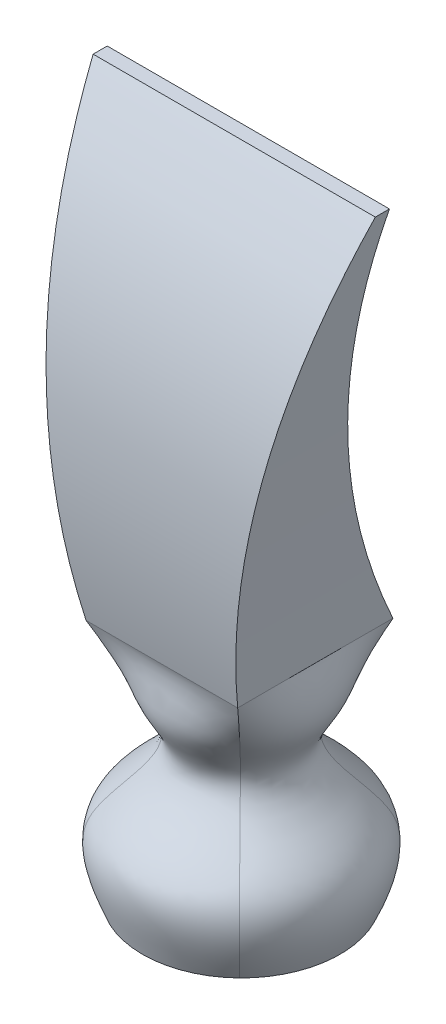
ISO-10303-21;
HEADER;
FILE_DESCRIPTION(('STEP AP214'),'2;1');
FILE_NAME('part.step','',(''),(''),'','','');
FILE_SCHEMA(('AUTOMOTIVE_DESIGN { 1 0 10303 214 1 1 1 1 }'));
ENDSEC;
DATA;
#1=APPLICATION_CONTEXT('core data for automotive mechanical design processes');
#2=APPLICATION_PROTOCOL_DEFINITION('international standard','automotive_design',2000,#1);
#3=PRODUCT_CONTEXT('',#1,'mechanical');
#4=PRODUCT('Part','Part','',(#3));
#5=PRODUCT_RELATED_PRODUCT_CATEGORY('part','',(#4));
#6=PRODUCT_DEFINITION_FORMATION('','',#4);
#7=PRODUCT_DEFINITION_CONTEXT('part definition',#1,'design');
#8=PRODUCT_DEFINITION('design','',#6,#7);
#9=PRODUCT_DEFINITION_SHAPE('','',#8);
#10=(LENGTH_UNIT() NAMED_UNIT(*) SI_UNIT(.MILLI.,.METRE.));
#11=(NAMED_UNIT(*) PLANE_ANGLE_UNIT() SI_UNIT($,.RADIAN.));
#12=(NAMED_UNIT(*) SI_UNIT($,.STERADIAN.) SOLID_ANGLE_UNIT());
#13=UNCERTAINTY_MEASURE_WITH_UNIT(LENGTH_MEASURE(1.E-05),#10,'distance_accuracy_value','');
#14=(GEOMETRIC_REPRESENTATION_CONTEXT(3) GLOBAL_UNCERTAINTY_ASSIGNED_CONTEXT((#13)) GLOBAL_UNIT_ASSIGNED_CONTEXT((#10,
#11,#12)) REPRESENTATION_CONTEXT('',''));
#15=CARTESIAN_POINT('',(0.,0.,0.));
#16=DIRECTION('',(0.,0.,1.));
#17=DIRECTION('',(1.,0.,0.));
#18=AXIS2_PLACEMENT_3D('',#15,#16,#17);
#19=CARTESIAN_POINT('',(0.,0.,0.));
#20=DIRECTION('',(0.,1.,0.));
#21=DIRECTION('',(0.,0.,1.));
#22=AXIS2_PLACEMENT_3D('',#19,#20,#21);
#23=PLANE('',#22);
#24=CARTESIAN_POINT('',(0.,0.,0.));
#25=DIRECTION('',(0.,1.,0.));
#26=DIRECTION('',(0.,0.,1.));
#27=AXIS2_PLACEMENT_3D('',#24,#25,#26);
#28=CIRCLE('',#27,35.);
#29=CARTESIAN_POINT('',(24.4568286600707,0.,25.037242897171));
#30=VERTEX_POINT('',#29);
#31=CARTESIAN_POINT('',(24.4568286600707,0.,-25.0372428971711));
#32=VERTEX_POINT('',#31);
#33=EDGE_CURVE('E444',#30,#32,#28,.T.);
#34=ORIENTED_EDGE('',*,*,#33,.F.);
#35=CARTESIAN_POINT('',(-24.4568286600708,0.,25.037242897171));
#36=VERTEX_POINT('',#35);
#37=EDGE_CURVE('E287',#36,#30,#28,.T.);
#38=ORIENTED_EDGE('',*,*,#37,.F.);
#39=CARTESIAN_POINT('',(-24.4568286600707,0.,-25.037242897171));
#40=VERTEX_POINT('',#39);
#41=EDGE_CURVE('E455',#40,#36,#28,.T.);
#42=ORIENTED_EDGE('',*,*,#41,.F.);
#43=EDGE_CURVE('E451',#32,#40,#28,.T.);
#44=ORIENTED_EDGE('',*,*,#43,.F.);
#45=EDGE_LOOP('',(#34,#38,#42,#44));
#46=FACE_BOUND('',#45,.T.);
#47=ADVANCED_FACE('F189',(#46),#23,.F.);
#48=CARTESIAN_POINT('',(-24.4568286600707,0.,-25.037242897171));
#49=CARTESIAN_POINT('',(-27.399340941846,9.29663608562691,-28.0495874554414));
#50=CARTESIAN_POINT('',(-31.13445017752,27.9698970219637,-31.8897370915867));
#51=CARTESIAN_POINT('',(-9.03288607464205,45.1614896950675,-9.19041981699762));
#52=CARTESIAN_POINT('',(-19.9641415545963,66.5098480963599,-20.5564148321014));
#53=CARTESIAN_POINT('',(-24.3797828143427,78.4865117207972,-24.613655684619));
#54=CARTESIAN_POINT('',(-27.5,85.,-27.5));
#55=CARTESIAN_POINT('',(-26.1422855158477,0.,-23.3908583609433));
#56=CARTESIAN_POINT('',(-29.274811107581,9.29666061844231,-26.1946591791497));
#57=CARTESIAN_POINT('',(-33.3386493278666,27.9742060717197,-29.8139769824717));
#58=CARTESIAN_POINT('',(-9.47722497475231,45.1465067376922,-8.53279418407706));
#59=CARTESIAN_POINT('',(-21.7094282775271,66.5410850836467,-19.3141550163875));
#60=CARTESIAN_POINT('',(-24.9859238604661,78.3956275287834,-22.6773271838854));
#61=CARTESIAN_POINT('',(-27.5,85.,-25.2083333333333));
#62=CARTESIAN_POINT('',(-29.1456387891159,0.,-19.796098818231));
#63=CARTESIAN_POINT('',(-32.6581910007652,9.29670968407309,-22.1828121563094));
#64=CARTESIAN_POINT('',(-37.2358710883294,27.9828241712317,-25.24280284972));
#65=CARTESIAN_POINT('',(-10.294317579995,45.1165408229417,-7.15867958893231));
#66=CARTESIAN_POINT('',(-24.7729799374522,66.6035590582203,-16.4788044935238));
#67=CARTESIAN_POINT('',(-26.1982059527127,78.2138591447559,-18.804670182418));
#68=CARTESIAN_POINT('',(-27.5,85.,-20.625));
#69=CARTESIAN_POINT('',(-32.4672817206729,0.,-13.6661162175791));
#70=CARTESIAN_POINT('',(-36.3719989349256,9.29653958164828,-15.3088633728345));
#71=CARTESIAN_POINT('',(-41.5640845382798,27.9877406329618,-17.4416287093693));
#72=CARTESIAN_POINT('',(-11.1902813508322,45.0998300238232,-4.89533090328975));
#73=CARTESIAN_POINT('',(-28.1729827413746,66.6383680125747,-11.4726871464239));
#74=CARTESIAN_POINT('',(-27.5066219871479,78.1125958875504,-12.7007475080827));
#75=CARTESIAN_POINT('',(-27.5,85.0000000000001,-13.75));
#76=CARTESIAN_POINT('',(-34.5248320103974,0.,-7.02994300799264));
#77=CARTESIAN_POINT('',(-38.6791031346036,9.29672060989547,-7.87636956410796));
#78=CARTESIAN_POINT('',(-44.2398553148131,27.9893395313958,-8.97733972203747));
#79=CARTESIAN_POINT('',(-11.7507376209475,45.0939370748818,-2.50124207543735));
#80=CARTESIAN_POINT('',(-30.2687022347564,66.6506801310087,-5.93686263514309));
#81=CARTESIAN_POINT('',(-28.3468179264592,78.0767619113947,-6.43088185432212));
#82=CARTESIAN_POINT('',(-27.5,85.,-6.875));
#83=CARTESIAN_POINT('',(-35.2375839948012,0.,0.));
#84=CARTESIAN_POINT('',(-39.476962194166,9.29659382349259,0.));
#85=CARTESIAN_POINT('',(-45.1676191008502,27.9895538065451,0.));
#86=CARTESIAN_POINT('',(-11.9445194572559,45.093440277809,0.));
#87=CARTESIAN_POINT('',(-30.9952309837039,66.6516962929739,0.));
#88=CARTESIAN_POINT('',(-28.6363471343313,78.0738141662538,0.));
#89=CARTESIAN_POINT('',(-27.5,85.,0.));
#90=CARTESIAN_POINT('',(-34.5248320103974,0.,7.02994300799262));
#91=CARTESIAN_POINT('',(-38.6791031346037,9.29672060989549,7.87636956410796));
#92=CARTESIAN_POINT('',(-44.2398553148133,27.9893395313958,8.97733972203748));
#93=CARTESIAN_POINT('',(-11.7507376209475,45.0939370748819,2.50124207543732));
#94=CARTESIAN_POINT('',(-30.2687022347564,66.6506801310086,5.93686263514309));
#95=CARTESIAN_POINT('',(-28.3468179264593,78.0767619113946,6.43088185432212));
#96=CARTESIAN_POINT('',(-27.5,85.,6.875));
#97=CARTESIAN_POINT('',(-32.4672817206729,0.,13.6661162175791));
#98=CARTESIAN_POINT('',(-36.3719989349255,9.29653958164824,15.3088633728344));
#99=CARTESIAN_POINT('',(-41.5640845382795,27.9877406329618,17.4416287093693));
#100=CARTESIAN_POINT('',(-11.1902813508323,45.0998300238231,4.89533090328977));
#101=CARTESIAN_POINT('',(-28.1729827413746,66.6383680125748,11.4726871464239));
#102=CARTESIAN_POINT('',(-27.5066219871479,78.1125958875505,12.7007475080827));
#103=CARTESIAN_POINT('',(-27.5,85.,13.75));
#104=CARTESIAN_POINT('',(-29.1456387891159,0.,19.796098818231));
#105=CARTESIAN_POINT('',(-32.6581910007653,9.29670968407311,22.1828121563094));
#106=CARTESIAN_POINT('',(-37.2358710883296,27.9828241712318,25.24280284972));
#107=CARTESIAN_POINT('',(-10.294317579995,45.1165408229417,7.15867958893229));
#108=CARTESIAN_POINT('',(-24.7729799374522,66.6035590582203,16.4788044935238));
#109=CARTESIAN_POINT('',(-26.1982059527127,78.2138591447558,18.804670182418));
#110=CARTESIAN_POINT('',(-27.5,85.,20.625));
#111=CARTESIAN_POINT('',(-26.1422855158477,0.,23.3908583609433));
#112=CARTESIAN_POINT('',(-29.274811107581,9.29666061844231,26.1946591791497));
#113=CARTESIAN_POINT('',(-33.3386493278666,27.9742060717197,29.8139769824717));
#114=CARTESIAN_POINT('',(-9.47722497475231,45.1465067376922,8.53279418407707));
#115=CARTESIAN_POINT('',(-21.7094282775271,66.5410850836467,19.3141550163875));
#116=CARTESIAN_POINT('',(-24.9859238604661,78.3956275287834,22.6773271838854));
#117=CARTESIAN_POINT('',(-27.5,85.,25.2083333333333));
#118=CARTESIAN_POINT('',(-24.4568286600708,0.,25.037242897171));
#119=CARTESIAN_POINT('',(-27.399340941846,9.29663608562691,28.0495874554414));
#120=CARTESIAN_POINT('',(-31.13445017752,27.9698970219637,31.8897370915867));
#121=CARTESIAN_POINT('',(-9.03288607464205,45.1614896950675,9.19041981699762));
#122=CARTESIAN_POINT('',(-19.9641415545964,66.5098480963599,20.5564148321014));
#123=CARTESIAN_POINT('',(-24.3797828143427,78.4865117207972,24.613655684619));
#124=CARTESIAN_POINT('',(-27.5,85.,27.5));
#125=B_SPLINE_SURFACE_WITH_KNOTS('',3,3,((#48,#49,#50,#51,#52,#53,#54),(#55,#56,#57,#58,#59,#60,
#61),(#62,#63,#64,#65,#66,#67,#68),(#69,#70,#71,#72,#73,#74,#75),(#76,#77,#78,#79,#80,#81,#82),
(#83,#84,#85,#86,#87,#88,#89),(#90,#91,#92,#93,#94,#95,#96),(#97,#98,#99,#100,#101,#102,#103),
(#104,#105,#106,#107,#108,#109,#110),(#111,#112,#113,#114,#115,#116,#117),(#118,#119,#120,#121,
#122,#123,#124)),.UNSPECIFIED.,.F.,.F.,.F.,(4,1,1,1,1,1,1,1,4),(4,1,1,1,4),(0.,0.125,0.25,0.375,
0.5,0.625,0.75,0.875,1.),(0.,0.267666717961373,0.595145262150059,0.771109748555565,1.),.UNSPECIFIED.);
#126=CARTESIAN_POINT('',(-24.4568286600708,0.,25.037242897171));
#127=CARTESIAN_POINT('',(-27.399340941846,9.29663608562691,28.0495874554414));
#128=CARTESIAN_POINT('',(-31.13445017752,27.9698970219637,31.8897370915867));
#129=CARTESIAN_POINT('',(-9.03288607464205,45.1614896950675,9.19041981699762));
#130=CARTESIAN_POINT('',(-19.9641415545964,66.5098480963599,20.5564148321014));
#131=CARTESIAN_POINT('',(-24.3797828143427,78.4865117207972,24.613655684619));
#132=CARTESIAN_POINT('',(-27.5,85.,27.5));
#133=B_SPLINE_CURVE_WITH_KNOTS('',3,(#126,#127,#128,#129,#130,#131,#132),.UNSPECIFIED.,.F.,.F.,
(4,1,1,1,4),(0.,0.267666717961373,0.595145262150059,0.771109748555565,1.),.UNSPECIFIED.);
#134=CARTESIAN_POINT('',(-27.5,85.,27.5));
#135=VERTEX_POINT('',#134);
#136=EDGE_CURVE('E501',#36,#135,#133,.T.);
#137=DIRECTION('',(0.,0.,1.));
#138=VECTOR('',#137,1.);
#139=CARTESIAN_POINT('',(-27.5,85.,-27.5));
#140=LINE('',#139,#138);
#141=CARTESIAN_POINT('',(-27.5,85.,-27.5));
#142=VERTEX_POINT('',#141);
#143=EDGE_CURVE('E202',#142,#135,#140,.T.);
#144=CARTESIAN_POINT('',(-24.4568286600707,0.,-25.037242897171));
#145=CARTESIAN_POINT('',(-27.399340941846,9.29663608562691,-28.0495874554414));
#146=CARTESIAN_POINT('',(-31.13445017752,27.9698970219637,-31.8897370915867));
#147=CARTESIAN_POINT('',(-9.03288607464205,45.1614896950675,-9.19041981699762));
#148=CARTESIAN_POINT('',(-19.9641415545963,66.5098480963599,-20.5564148321014));
#149=CARTESIAN_POINT('',(-24.3797828143427,78.4865117207972,-24.613655684619));
#150=CARTESIAN_POINT('',(-27.5,85.,-27.5));
#151=B_SPLINE_CURVE_WITH_KNOTS('',3,(#144,#145,#146,#147,#148,#149,#150),.UNSPECIFIED.,.F.,.F.,
(4,1,1,1,4),(0.,0.267666717961373,0.595145262150059,0.771109748555565,1.),.UNSPECIFIED.);
#152=EDGE_CURVE('E504',#142,#40,#151,.F.);
#153=ORIENTED_EDGE('',*,*,#41,.T.);
#154=ORIENTED_EDGE('',*,*,#136,.T.);
#155=ORIENTED_EDGE('',*,*,#143,.F.);
#156=ORIENTED_EDGE('',*,*,#152,.T.);
#157=EDGE_LOOP('',(#153,#154,#155,#156));
#158=FACE_BOUND('',#157,.T.);
#159=ADVANCED_FACE('F520',(#158),#125,.T.);
#160=CARTESIAN_POINT('',(-24.4568286600708,0.,25.037242897171));
#161=CARTESIAN_POINT('',(-27.399340941846,9.29663608562691,28.0495874554414));
#162=CARTESIAN_POINT('',(-31.13445017752,27.9698970219637,31.8897370915867));
#163=CARTESIAN_POINT('',(-9.03288607464205,45.1614896950675,9.19041981699761));
#164=CARTESIAN_POINT('',(-19.9641415545964,66.5098480963599,20.5564148321014));
#165=CARTESIAN_POINT('',(-24.3797828143427,78.4865117207972,24.613655684619));
#166=CARTESIAN_POINT('',(-27.5,85.,27.5));
#167=CARTESIAN_POINT('',(-10.8664064473902,0.,38.3126114686484));
#168=CARTESIAN_POINT('',(-11.8472438746486,9.29663608562691,41.3249560269188));
#169=CARTESIAN_POINT('',(-14.1417780026572,27.9707826359351,50.352495786497));
#170=CARTESIAN_POINT('',(-3.57764647639151,45.1584201135384,11.7747419044727));
#171=CARTESIAN_POINT('',(-9.728521663523,66.5162468948495,35.9817913280261));
#172=CARTESIAN_POINT('',(-8.35759120619668,78.4678947262217,24.6066381393334));
#173=CARTESIAN_POINT('',(-9.59167063870443,85.,27.5));
#174=CARTESIAN_POINT('',(10.8664064473901,0.,38.3126114686484));
#175=CARTESIAN_POINT('',(11.8472438746486,9.29663608562691,41.3249560269188));
#176=CARTESIAN_POINT('',(14.1747437069648,27.9716682499065,50.3528296124604));
#177=CARTESIAN_POINT('',(3.46338572587735,45.1553505320094,11.773584847285));
#178=CARTESIAN_POINT('',(9.96670771947166,66.5226456933391,35.9842033101531));
#179=CARTESIAN_POINT('',(7.66460040194936,78.4492777316463,24.5996205940479));
#180=CARTESIAN_POINT('',(8.31665872259113,85.,27.5));
#181=CARTESIAN_POINT('',(24.4568286600707,0.,25.037242897171));
#182=CARTESIAN_POINT('',(27.399340941846,9.29663608562691,28.0495874554414));
#183=CARTESIAN_POINT('',(31.1674158818276,27.9725538638778,31.8907385694769));
#184=CARTESIAN_POINT('',(8.91862532412789,45.1522809504804,9.18694864543438));
#185=CARTESIAN_POINT('',(20.202327610545,66.5290444918287,20.5636507784824));
#186=CARTESIAN_POINT('',(23.6867920100954,78.430660737071,24.5926030487623));
#187=CARTESIAN_POINT('',(26.2249880838867,85.,27.5));
#188=B_SPLINE_SURFACE_WITH_KNOTS('',3,3,((#160,#161,#162,#163,#164,#165,#166),(#167,#168,#169,
#170,#171,#172,#173),(#174,#175,#176,#177,#178,#179,#180),(#181,#182,#183,#184,#185,#186,#187)),
.UNSPECIFIED.,.F.,.F.,.F.,(4,4),(4,1,1,1,4),(0.,1.),(0.,0.267666717961373,0.595145262150059,
0.771109748555565,1.),.UNSPECIFIED.);
#189=CARTESIAN_POINT('',(24.4568286600707,0.,25.037242897171));
#190=CARTESIAN_POINT('',(27.399340941846,9.29663608562691,28.0495874554414));
#191=CARTESIAN_POINT('',(31.1674158818276,27.9725538638778,31.8907385694769));
#192=CARTESIAN_POINT('',(8.91862532412789,45.1522809504804,9.18694864543438));
#193=CARTESIAN_POINT('',(20.202327610545,66.5290444918287,20.5636507784824));
#194=CARTESIAN_POINT('',(23.6867920100954,78.430660737071,24.5926030487623));
#195=CARTESIAN_POINT('',(26.2249880838867,85.,27.5));
#196=B_SPLINE_CURVE_WITH_KNOTS('',3,(#189,#190,#191,#192,#193,#194,#195),.UNSPECIFIED.,.F.,.F.,
(4,1,1,1,4),(0.,0.267666717961373,0.595145262150059,0.771109748555565,1.),.UNSPECIFIED.);
#197=CARTESIAN_POINT('',(26.2249880838867,85.,27.5));
#198=VERTEX_POINT('',#197);
#199=EDGE_CURVE('E497',#30,#198,#196,.T.);
#200=DIRECTION('',(1.,0.,0.));
#201=VECTOR('',#200,1.);
#202=CARTESIAN_POINT('',(-27.5,85.,27.5));
#203=LINE('',#202,#201);
#204=EDGE_CURVE('E477',#135,#198,#203,.T.);
#205=ORIENTED_EDGE('',*,*,#37,.T.);
#206=ORIENTED_EDGE('',*,*,#199,.T.);
#207=ORIENTED_EDGE('',*,*,#204,.F.);
#208=ORIENTED_EDGE('',*,*,#136,.F.);
#209=EDGE_LOOP('',(#205,#206,#207,#208));
#210=FACE_BOUND('',#209,.T.);
#211=ADVANCED_FACE('F513',(#210),#188,.T.);
#212=CARTESIAN_POINT('',(24.4568286600707,0.,-25.037242897171));
#213=CARTESIAN_POINT('',(27.399340941846,9.29663608562691,-28.0495874554414));
#214=CARTESIAN_POINT('',(31.1674158818276,27.9725538638778,-31.8907385694769));
#215=CARTESIAN_POINT('',(8.91862532412789,45.1522809504804,-9.18694864543438));
#216=CARTESIAN_POINT('',(20.202327610545,66.5290444918287,-20.5636507784824));
#217=CARTESIAN_POINT('',(23.6867920100954,78.430660737071,-24.5926030487623));
#218=CARTESIAN_POINT('',(26.2249880838867,85.,-27.5));
#219=CARTESIAN_POINT('',(10.8664064473902,0.,-38.3126114686484));
#220=CARTESIAN_POINT('',(11.8472438746486,9.29663608562691,-41.3249560269188));
#221=CARTESIAN_POINT('',(14.1747437069648,27.9716682499065,-50.3528296124604));
#222=CARTESIAN_POINT('',(3.46338572587735,45.1553505320094,-11.773584847285));
#223=CARTESIAN_POINT('',(9.96670771947166,66.5226456933391,-35.9842033101531));
#224=CARTESIAN_POINT('',(7.66460040194936,78.4492777316463,-24.5996205940479));
#225=CARTESIAN_POINT('',(8.31665872259112,85.,-27.5));
#226=CARTESIAN_POINT('',(-10.8664064473902,0.,-38.3126114686484));
#227=CARTESIAN_POINT('',(-11.8472438746486,9.29663608562691,-41.3249560269188));
#228=CARTESIAN_POINT('',(-14.1417780026572,27.9707826359351,-50.352495786497));
#229=CARTESIAN_POINT('',(-3.57764647639151,45.1584201135384,-11.7747419044727));
#230=CARTESIAN_POINT('',(-9.72852166352298,66.5162468948495,-35.9817913280261));
#231=CARTESIAN_POINT('',(-8.35759120619668,78.4678947262217,-24.6066381393335));
#232=CARTESIAN_POINT('',(-9.59167063870444,85.,-27.5));
#233=CARTESIAN_POINT('',(-24.4568286600707,0.,-25.037242897171));
#234=CARTESIAN_POINT('',(-27.399340941846,9.29663608562691,-28.0495874554414));
#235=CARTESIAN_POINT('',(-31.13445017752,27.9698970219637,-31.8897370915867));
#236=CARTESIAN_POINT('',(-9.03288607464205,45.1614896950675,-9.19041981699762));
#237=CARTESIAN_POINT('',(-19.9641415545963,66.5098480963599,-20.5564148321014));
#238=CARTESIAN_POINT('',(-24.3797828143427,78.4865117207972,-24.613655684619));
#239=CARTESIAN_POINT('',(-27.5,85.,-27.5));
#240=B_SPLINE_SURFACE_WITH_KNOTS('',3,3,((#212,#213,#214,#215,#216,#217,#218),(#219,#220,#221,
#222,#223,#224,#225),(#226,#227,#228,#229,#230,#231,#232),(#233,#234,#235,#236,#237,#238,#239)),
.UNSPECIFIED.,.F.,.F.,.F.,(4,4),(4,1,1,1,4),(0.,1.),(0.,0.267666717961373,0.595145262150059,
0.771109748555565,1.),.UNSPECIFIED.);
#241=DIRECTION('',(-1.,0.,0.));
#242=VECTOR('',#241,1.);
#243=CARTESIAN_POINT('',(-27.5,85.,-27.5));
#244=LINE('',#243,#242);
#245=CARTESIAN_POINT('',(26.2249880838867,85.,-27.5));
#246=VERTEX_POINT('',#245);
#247=EDGE_CURVE('E13',#246,#142,#244,.T.);
#248=CARTESIAN_POINT('',(24.4568286600707,0.,-25.0372428971711));
#249=CARTESIAN_POINT('',(27.399340941846,9.29663608562691,-28.0495874554414));
#250=CARTESIAN_POINT('',(31.1674158818276,27.9725538638778,-31.8907385694769));
#251=CARTESIAN_POINT('',(8.91862532412789,45.1522809504804,-9.18694864543438));
#252=CARTESIAN_POINT('',(20.202327610545,66.5290444918287,-20.5636507784824));
#253=CARTESIAN_POINT('',(23.6867920100954,78.430660737071,-24.5926030487623));
#254=CARTESIAN_POINT('',(26.2249880838867,85.,-27.5));
#255=B_SPLINE_CURVE_WITH_KNOTS('',3,(#248,#249,#250,#251,#252,#253,#254),.UNSPECIFIED.,.F.,.F.,
(4,1,1,1,4),(0.,0.267666717961373,0.595145262150059,0.771109748555565,1.),.UNSPECIFIED.);
#256=EDGE_CURVE('E210',#32,#246,#255,.T.);
#257=ORIENTED_EDGE('',*,*,#43,.T.);
#258=ORIENTED_EDGE('',*,*,#152,.F.);
#259=ORIENTED_EDGE('',*,*,#247,.F.);
#260=ORIENTED_EDGE('',*,*,#256,.F.);
#261=EDGE_LOOP('',(#257,#258,#259,#260));
#262=FACE_BOUND('',#261,.T.);
#263=ADVANCED_FACE('F518',(#262),#240,.T.);
#264=CARTESIAN_POINT('',(24.4568286600708,0.,25.037242897171));
#265=CARTESIAN_POINT('',(27.399340941846,9.29663608562691,28.0495874554414));
#266=CARTESIAN_POINT('',(31.1674158818276,27.9725538638778,31.8907385694769));
#267=CARTESIAN_POINT('',(8.91862532412789,45.1522809504804,9.18694864543438));
#268=CARTESIAN_POINT('',(20.202327610545,66.5290444918287,20.5636507784824));
#269=CARTESIAN_POINT('',(23.6867920100954,78.430660737071,24.5926030487623));
#270=CARTESIAN_POINT('',(26.2249880838867,85.,27.5));
#271=CARTESIAN_POINT('',(26.1422855158477,0.,23.3908583609433));
#272=CARTESIAN_POINT('',(29.274811107581,9.29666061844231,26.1946591791497));
#273=CARTESIAN_POINT('',(33.3712854071182,27.9765214934928,29.8147730031464));
#274=CARTESIAN_POINT('',(9.36410672087459,45.1384813720855,8.53003513731542));
#275=CARTESIAN_POINT('',(21.9452327040314,66.5578146270183,19.3199064792773));
#276=CARTESIAN_POINT('',(24.2998622918432,78.3469537318661,22.660593580914));
#277=CARTESIAN_POINT('',(26.2249880838867,85.,25.2083333333333));
#278=CARTESIAN_POINT('',(29.1456387891159,0.,19.796098818231));
#279=CARTESIAN_POINT('',(32.6581910007653,9.29670968407309,22.1828121563094));
#280=CARTESIAN_POINT('',(37.2678479174689,27.9844567527228,25.2431879559638));
#281=CARTESIAN_POINT('',(10.1834843193902,45.1108822152958,7.15734479177384));
#282=CARTESIAN_POINT('',(25.0040211050675,66.6153548973975,16.481586989431));
#283=CARTESIAN_POINT('',(25.5260028553388,78.1795397214564,18.7965746452175));
#284=CARTESIAN_POINT('',(26.2249880838867,85.,20.625));
#285=CARTESIAN_POINT('',(32.4672817206729,0.,13.6661162175791));
#286=CARTESIAN_POINT('',(36.3719989349256,9.29653958164828,15.3088633728345));
#287=CARTESIAN_POINT('',(41.5955749054935,27.9882632615613,17.4416899236862));
#288=CARTESIAN_POINT('',(11.0811341911589,45.0980185674244,4.89511873146022));
#289=CARTESIAN_POINT('',(28.4005090910931,66.6421441443891,11.4731294362831));
#290=CARTESIAN_POINT('',(26.8446450823671,78.1016094147587,12.6994606871391));
#291=CARTESIAN_POINT('',(26.2249880838867,85.0000000000001,13.75));
#292=CARTESIAN_POINT('',(34.5248320103974,0.,7.02994300799262));
#293=CARTESIAN_POINT('',(38.6791031346035,9.29672060989547,7.87636956410795));
#294=CARTESIAN_POINT('',(44.271128482703,27.9890788131029,8.97730222073211));
#295=CARTESIAN_POINT('',(11.6423432848001,45.0948407372925,2.50137205680393));
#296=CARTESIAN_POINT('',(30.4946592611016,66.6487963714102,5.9365916781529));
#297=CARTESIAN_POINT('',(27.6894068920953,78.0822426187935,6.43167019057384));
#298=CARTESIAN_POINT('',(26.2249880838867,85.,6.875));
#299=CARTESIAN_POINT('',(35.2375839948013,0.,0.));
#300=CARTESIAN_POINT('',(39.476962194166,9.2965938234926,0.));
#301=CARTESIAN_POINT('',(45.1988445068793,27.9890007311339,0.));
#302=CARTESIAN_POINT('',(11.8362906660643,45.0953572643529,0.));
#303=CARTESIAN_POINT('',(31.2208429177934,66.647700174778,0.));
#304=CARTESIAN_POINT('',(27.9799401291865,78.0854406787774,0.));
#305=CARTESIAN_POINT('',(26.2249880838867,85.,0.));
#306=CARTESIAN_POINT('',(34.5248320103974,0.,-7.02994300799265));
#307=CARTESIAN_POINT('',(38.6791031346036,9.29672060989549,-7.87636956410798));
#308=CARTESIAN_POINT('',(44.2711284827032,27.9890788131029,-8.97730222073212));
#309=CARTESIAN_POINT('',(11.6423432848,45.0948407372926,-2.50137205680396));
#310=CARTESIAN_POINT('',(30.4946592611016,66.6487963714101,-5.93659167815288));
#311=CARTESIAN_POINT('',(27.6894068920953,78.0822426187934,-6.43167019057383));
#312=CARTESIAN_POINT('',(26.2249880838867,85.,-6.875));
#313=CARTESIAN_POINT('',(32.467281720673,0.,-13.6661162175791));
#314=CARTESIAN_POINT('',(36.3719989349255,9.29653958164824,-15.3088633728344));
#315=CARTESIAN_POINT('',(41.5955749054933,27.9882632615612,-17.4416899236863));
#316=CARTESIAN_POINT('',(11.081134191159,45.0980185674243,-4.89511873146021));
#317=CARTESIAN_POINT('',(28.4005090910931,66.6421441443893,-11.4731294362832));
#318=CARTESIAN_POINT('',(26.844645082367,78.1016094147589,-12.6994606871391));
#319=CARTESIAN_POINT('',(26.2249880838867,85.,-13.75));
#320=CARTESIAN_POINT('',(29.1456387891159,0.,-19.7960988182311));
#321=CARTESIAN_POINT('',(32.6581910007653,9.29670968407311,-22.1828121563094));
#322=CARTESIAN_POINT('',(37.2678479174691,27.9844567527228,-25.2431879559638));
#323=CARTESIAN_POINT('',(10.1834843193902,45.1108822152958,-7.15734479177386));
#324=CARTESIAN_POINT('',(25.0040211050675,66.6153548973975,-16.481586989431));
#325=CARTESIAN_POINT('',(25.5260028553388,78.1795397214561,-18.7965746452175));
#326=CARTESIAN_POINT('',(26.2249880838867,85.,-20.625));
#327=CARTESIAN_POINT('',(26.1422855158477,0.,-23.3908583609433));
#328=CARTESIAN_POINT('',(29.274811107581,9.29666061844231,-26.1946591791497));
#329=CARTESIAN_POINT('',(33.3712854071182,27.9765214934928,-29.8147730031464));
#330=CARTESIAN_POINT('',(9.3641067208746,45.1384813720855,-8.53003513731542));
#331=CARTESIAN_POINT('',(21.9452327040313,66.5578146270184,-19.3199064792773));
#332=CARTESIAN_POINT('',(24.2998622918432,78.346953731866,-22.660593580914));
#333=CARTESIAN_POINT('',(26.2249880838867,85.,-25.2083333333333));
#334=CARTESIAN_POINT('',(24.4568286600707,0.,-25.0372428971711));
#335=CARTESIAN_POINT('',(27.399340941846,9.29663608562691,-28.0495874554414));
#336=CARTESIAN_POINT('',(31.1674158818276,27.9725538638778,-31.8907385694769));
#337=CARTESIAN_POINT('',(8.91862532412789,45.1522809504804,-9.18694864543438));
#338=CARTESIAN_POINT('',(20.202327610545,66.5290444918287,-20.5636507784824));
#339=CARTESIAN_POINT('',(23.6867920100954,78.430660737071,-24.5926030487623));
#340=CARTESIAN_POINT('',(26.2249880838867,85.,-27.5));
#341=B_SPLINE_SURFACE_WITH_KNOTS('',3,3,((#264,#265,#266,#267,#268,#269,#270),(#271,#272,#273,
#274,#275,#276,#277),(#278,#279,#280,#281,#282,#283,#284),(#285,#286,#287,#288,#289,#290,#291),
(#292,#293,#294,#295,#296,#297,#298),(#299,#300,#301,#302,#303,#304,#305),(#306,#307,#308,#309,
#310,#311,#312),(#313,#314,#315,#316,#317,#318,#319),(#320,#321,#322,#323,#324,#325,#326),(#327,
#328,#329,#330,#331,#332,#333),(#334,#335,#336,#337,#338,#339,#340)),.UNSPECIFIED.,.F.,.F.,.F.,
(4,1,1,1,1,1,1,1,4),(4,1,1,1,4),(0.,0.125,0.25,0.375,0.5,0.625,0.75,0.875,1.),(0.,
0.267666717961373,0.595145262150059,0.771109748555565,1.),.UNSPECIFIED.);
#342=DIRECTION('',(0.,0.,-1.));
#343=VECTOR('',#342,1.);
#344=CARTESIAN_POINT('',(26.2249880838867,85.,-27.5));
#345=LINE('',#344,#343);
#346=EDGE_CURVE('E485',#198,#246,#345,.T.);
#347=ORIENTED_EDGE('',*,*,#33,.T.);
#348=ORIENTED_EDGE('',*,*,#256,.T.);
#349=ORIENTED_EDGE('',*,*,#346,.F.);
#350=ORIENTED_EDGE('',*,*,#199,.F.);
#351=EDGE_LOOP('',(#347,#348,#349,#350));
#352=FACE_BOUND('',#351,.T.);
#353=ADVANCED_FACE('F191',(#352),#341,.T.);
#354=CARTESIAN_POINT('',(0.,235.,0.));
#355=DIRECTION('',(0.,1.,0.));
#356=DIRECTION('',(0.,0.,1.));
#357=AXIS2_PLACEMENT_3D('',#354,#355,#356);
#358=PLANE('',#357);
#359=DIRECTION('',(0.,0.,-1.));
#360=VECTOR('',#359,1.);
#361=CARTESIAN_POINT('',(50.,235.,-2.5));
#362=LINE('',#361,#360);
#363=CARTESIAN_POINT('',(50.,235.,2.5));
#364=VERTEX_POINT('',#363);
#365=CARTESIAN_POINT('',(50.,235.,-2.5));
#366=VERTEX_POINT('',#365);
#367=EDGE_CURVE('E277',#364,#366,#362,.T.);
#368=ORIENTED_EDGE('',*,*,#367,.T.);
#369=DIRECTION('',(-1.,0.,0.));
#370=VECTOR('',#369,1.);
#371=CARTESIAN_POINT('',(-50.,235.,-2.5));
#372=LINE('',#371,#370);
#373=CARTESIAN_POINT('',(-50.,235.,-2.5));
#374=VERTEX_POINT('',#373);
#375=EDGE_CURVE('E256',#366,#374,#372,.T.);
#376=ORIENTED_EDGE('',*,*,#375,.T.);
#377=DIRECTION('',(0.,0.,1.));
#378=VECTOR('',#377,1.);
#379=CARTESIAN_POINT('',(-50.,235.,-2.5));
#380=LINE('',#379,#378);
#381=CARTESIAN_POINT('',(-50.,235.,2.5));
#382=VERTEX_POINT('',#381);
#383=EDGE_CURVE('E247',#374,#382,#380,.T.);
#384=ORIENTED_EDGE('',*,*,#383,.T.);
#385=DIRECTION('',(1.,0.,0.));
#386=VECTOR('',#385,1.);
#387=CARTESIAN_POINT('',(-50.,235.,2.5));
#388=LINE('',#387,#386);
#389=EDGE_CURVE('E252',#382,#364,#388,.T.);
#390=ORIENTED_EDGE('',*,*,#389,.T.);
#391=EDGE_LOOP('',(#368,#376,#384,#390));
#392=FACE_BOUND('',#391,.T.);
#393=ADVANCED_FACE('F251',(#392),#358,.T.);
#394=CARTESIAN_POINT('',(-27.5,85.,27.5));
#395=CARTESIAN_POINT('',(-35.,138.761910413424,39.7000117517584));
#396=CARTESIAN_POINT('',(-42.5,188.761910413424,31.3666784184251));
#397=CARTESIAN_POINT('',(-50.,235.,2.5));
#398=CARTESIAN_POINT('',(-23.5917692850213,85.,27.5));
#399=CARTESIAN_POINT('',(-31.5260171422411,138.761910413424,39.7000117517584));
#400=CARTESIAN_POINT('',(-39.460264999461,188.761910413424,31.3666784184251));
#401=CARTESIAN_POINT('',(-47.3945128566809,235.,2.5));
#402=CARTESIAN_POINT('',(-18.8570622776485,85.0000000000001,27.5));
#403=CARTESIAN_POINT('',(-26.4225230755631,138.761910413424,39.7000117517584));
#404=CARTESIAN_POINT('',(-33.9879838734777,188.761910413424,31.3666784184251));
#405=CARTESIAN_POINT('',(-41.5534446713923,235.,2.5));
#406=CARTESIAN_POINT('',(-12.2768121643174,84.9999999999999,27.5));
#407=CARTESIAN_POINT('',(-18.2031912399131,138.761910413424,39.7000117517584));
#408=CARTESIAN_POINT('',(-24.1295703155088,188.761910413424,31.3666784184251));
#409=CARTESIAN_POINT('',(-30.0559493911045,235.,2.50000000000001));
#410=CARTESIAN_POINT('',(-6.43218323750633,85.,27.5));
#411=CARTESIAN_POINT('',(-9.00500292415759,138.761910413424,39.7000117517584));
#412=CARTESIAN_POINT('',(-11.5778226108089,188.761910413424,31.3666784184251));
#413=CARTESIAN_POINT('',(-14.1506422974601,235.,2.49999999999999));
#414=CARTESIAN_POINT('',(-2.25668906587423,85.,27.5));
#415=CARTESIAN_POINT('',(-2.90460801469582,138.761910413424,39.7000117517584));
#416=CARTESIAN_POINT('',(-3.55252696351741,188.761910413424,31.3666784184251));
#417=CARTESIAN_POINT('',(-4.20044591233899,235.,2.5));
#418=CARTESIAN_POINT('',(2.22039327444966,85.,27.5));
#419=CARTESIAN_POINT('',(2.85789132329789,138.761910413424,39.7000117517584));
#420=CARTESIAN_POINT('',(3.49538937214612,188.761910413424,31.3666784184251));
#421=CARTESIAN_POINT('',(4.13288742099434,235.,2.5));
#422=CARTESIAN_POINT('',(6.24030351111478,85.,27.5));
#423=CARTESIAN_POINT('',(8.82338409146394,138.761910413424,39.7000117517584));
#424=CARTESIAN_POINT('',(11.4064646718131,188.761910413424,31.3666784184251));
#425=CARTESIAN_POINT('',(13.9895452521623,235.,2.5));
#426=CARTESIAN_POINT('',(11.758807125271,85.0000000000001,27.5));
#427=CARTESIAN_POINT('',(17.8672028569958,138.761910413424,39.7000117517584));
#428=CARTESIAN_POINT('',(23.9755985887205,188.761910413424,31.3666784184251));
#429=CARTESIAN_POINT('',(30.0839943204452,235.,2.5));
#430=CARTESIAN_POINT('',(18.0156976003927,85.,27.5));
#431=CARTESIAN_POINT('',(25.8775832920687,138.761910413424,39.7000117517584));
#432=CARTESIAN_POINT('',(33.7394689837446,188.761910413424,31.3666784184251));
#433=CARTESIAN_POINT('',(41.6013546754206,235.,2.5));
#434=CARTESIAN_POINT('',(22.4041104565258,85.,27.5));
#435=CARTESIAN_POINT('',(30.7403280735732,138.761910413424,39.7000117517584));
#436=CARTESIAN_POINT('',(39.0765456906207,188.761910413424,31.3666784184251));
#437=CARTESIAN_POINT('',(47.4127633076681,235.,2.5));
#438=CARTESIAN_POINT('',(26.2249880838867,85.,27.5));
#439=CARTESIAN_POINT('',(34.1499920559245,138.761910413424,39.7000117517584));
#440=CARTESIAN_POINT('',(42.0749960279622,188.761910413424,31.3666784184251));
#441=CARTESIAN_POINT('',(50.,235.,2.5));
#442=B_SPLINE_SURFACE_WITH_KNOTS('',3,3,((#394,#395,#396,#397),(#398,#399,#400,#401),(#402,#403,
#404,#405),(#406,#407,#408,#409),(#410,#411,#412,#413),(#414,#415,#416,#417),(#418,#419,#420,
#421),(#422,#423,#424,#425),(#426,#427,#428,#429),(#430,#431,#432,#433),(#434,#435,#436,#437),
(#438,#439,#440,#441)),.UNSPECIFIED.,.F.,.F.,.F.,(4,1,1,1,2,1,1,1,4),(4,4),(0.638370629984611,
0.683940768256497,0.729510906528383,0.775081044800269,0.820651183072155,0.865488387304116,
0.910325591536078,0.955162795768039,1.),(0.,1.),.UNSPECIFIED.);
#443=CARTESIAN_POINT('',(26.2249880838867,85.,27.5));
#444=CARTESIAN_POINT('',(34.1499920559245,138.761910413424,39.7000117517584));
#445=CARTESIAN_POINT('',(42.0749960279622,188.761910413424,31.3666784184251));
#446=CARTESIAN_POINT('',(50.,235.,2.5));
#447=B_SPLINE_CURVE_WITH_KNOTS('',3,(#443,#444,#445,#446),.UNSPECIFIED.,.F.,.F.,(4,4),(0.,1.),.UNSPECIFIED.);
#448=EDGE_CURVE('E275',#198,#364,#447,.T.);
#449=CARTESIAN_POINT('',(-27.5,85.,27.5));
#450=CARTESIAN_POINT('',(-35.,138.761910413424,39.7000117517584));
#451=CARTESIAN_POINT('',(-42.5,188.761910413424,31.3666784184251));
#452=CARTESIAN_POINT('',(-50.,235.,2.5));
#453=B_SPLINE_CURVE_WITH_KNOTS('',3,(#449,#450,#451,#452),.UNSPECIFIED.,.F.,.F.,(4,4),(0.,1.),.UNSPECIFIED.);
#454=EDGE_CURVE('E273',#135,#382,#453,.T.);
#455=ORIENTED_EDGE('',*,*,#204,.T.);
#456=ORIENTED_EDGE('',*,*,#448,.T.);
#457=ORIENTED_EDGE('',*,*,#389,.F.);
#458=ORIENTED_EDGE('',*,*,#454,.F.);
#459=EDGE_LOOP('',(#455,#456,#457,#458));
#460=FACE_BOUND('',#459,.T.);
#461=ADVANCED_FACE('F272',(#460),#442,.T.);
#462=CARTESIAN_POINT('',(-27.5,85.,-27.5));
#463=CARTESIAN_POINT('',(-35.,138.761910413424,1.36667841842505));
#464=CARTESIAN_POINT('',(-42.5,188.761910413424,9.70001175175839));
#465=CARTESIAN_POINT('',(-50.,235.,-2.5));
#466=CARTESIAN_POINT('',(-27.5,85.,-22.9166666666667));
#467=CARTESIAN_POINT('',(-35.,138.761910413424,4.5611228628695));
#468=CARTESIAN_POINT('',(-42.5,188.761910413424,11.5055673073139));
#469=CARTESIAN_POINT('',(-50.,235.,-2.08333333333333));
#470=CARTESIAN_POINT('',(-27.5,85.0000000000001,-13.75));
#471=CARTESIAN_POINT('',(-35.,138.761910413424,10.9500117517584));
#472=CARTESIAN_POINT('',(-42.5,188.761910413424,15.1166784184251));
#473=CARTESIAN_POINT('',(-50.,235.,-1.25));
#474=CARTESIAN_POINT('',(-27.5,84.9999999999999,0.));
#475=CARTESIAN_POINT('',(-35.,138.761910413424,20.5333450850917));
#476=CARTESIAN_POINT('',(-42.5,188.761910413424,20.5333450850917));
#477=CARTESIAN_POINT('',(-50.,235.,0.));
#478=CARTESIAN_POINT('',(-27.5,85.0000000000001,13.75));
#479=CARTESIAN_POINT('',(-35.,138.761910413424,30.1166784184251));
#480=CARTESIAN_POINT('',(-42.5,188.761910413424,25.9500117517584));
#481=CARTESIAN_POINT('',(-50.0000000000001,235.,1.25));
#482=CARTESIAN_POINT('',(-27.5,85.,22.9166666666667));
#483=CARTESIAN_POINT('',(-35.,138.761910413424,36.5055673073139));
#484=CARTESIAN_POINT('',(-42.5,188.761910413424,29.5611228628695));
#485=CARTESIAN_POINT('',(-50.,235.,2.08333333333333));
#486=CARTESIAN_POINT('',(-27.5,85.,27.5));
#487=CARTESIAN_POINT('',(-35.,138.761910413424,39.7000117517584));
#488=CARTESIAN_POINT('',(-42.5,188.761910413424,31.3666784184251));
#489=CARTESIAN_POINT('',(-50.,235.,2.5));
#490=B_SPLINE_SURFACE_WITH_KNOTS('',3,3,((#462,#463,#464,#465),(#466,#467,#468,#469),(#470,#471,
#472,#473),(#474,#475,#476,#477),(#478,#479,#480,#481),(#482,#483,#484,#485),(#486,#487,#488,
#489)),.UNSPECIFIED.,.F.,.F.,.F.,(4,1,1,1,4),(4,4),(0.5,0.534592657496153,0.569185314992306,
0.603777972488458,0.638370629984611),(0.,1.),.UNSPECIFIED.);
#491=CARTESIAN_POINT('',(-27.5,85.,-27.5));
#492=CARTESIAN_POINT('',(-35.,138.761910413424,1.36667841842505));
#493=CARTESIAN_POINT('',(-42.5,188.761910413424,9.70001175175839));
#494=CARTESIAN_POINT('',(-50.,235.,-2.5));
#495=B_SPLINE_CURVE_WITH_KNOTS('',3,(#491,#492,#493,#494),.UNSPECIFIED.,.F.,.F.,(4,4),(0.,1.),.UNSPECIFIED.);
#496=EDGE_CURVE('E283',#142,#374,#495,.T.);
#497=ORIENTED_EDGE('',*,*,#143,.T.);
#498=ORIENTED_EDGE('',*,*,#454,.T.);
#499=ORIENTED_EDGE('',*,*,#383,.F.);
#500=ORIENTED_EDGE('',*,*,#496,.F.);
#501=EDGE_LOOP('',(#497,#498,#499,#500));
#502=FACE_BOUND('',#501,.T.);
#503=ADVANCED_FACE('F281',(#502),#490,.T.);
#504=CARTESIAN_POINT('',(26.2249880838867,85.,-27.5));
#505=CARTESIAN_POINT('',(34.1499920559244,138.761910413424,1.36667841842506));
#506=CARTESIAN_POINT('',(42.0749960279622,188.761910413424,9.70001175175839));
#507=CARTESIAN_POINT('',(50.,235.,-2.5));
#508=CARTESIAN_POINT('',(21.7479057435628,85.,-27.5));
#509=CARTESIAN_POINT('',(28.3874927179307,138.761910413424,1.36667841842506));
#510=CARTESIAN_POINT('',(35.0270796922987,188.761910413424,9.70001175175839));
#511=CARTESIAN_POINT('',(41.6666666666666,235.,-2.5));
#512=CARTESIAN_POINT('',(12.793741062915,85.,-27.5));
#513=CARTESIAN_POINT('',(16.8624940419433,138.761910413424,1.36667841842505));
#514=CARTESIAN_POINT('',(20.9312470209717,188.761910413423,9.70001175175839));
#515=CARTESIAN_POINT('',(25.,235.,-2.5));
#516=CARTESIAN_POINT('',(-0.637505958056651,85.,-27.5));
#517=CARTESIAN_POINT('',(-0.425003972037775,138.761910413424,1.36667841842507));
#518=CARTESIAN_POINT('',(-0.212501986018899,188.761910413424,9.7000117517584));
#519=CARTESIAN_POINT('',(0.,235.,-2.5));
#520=CARTESIAN_POINT('',(-14.0687529790283,85.,-27.5));
#521=CARTESIAN_POINT('',(-17.7125019860189,138.761910413424,1.36667841842503));
#522=CARTESIAN_POINT('',(-21.3562509930095,188.761910413424,9.70001175175838));
#523=CARTESIAN_POINT('',(-25.,235.,-2.5));
#524=CARTESIAN_POINT('',(-23.0229176596761,85.,-27.5));
#525=CARTESIAN_POINT('',(-29.2375006620063,138.761910413424,1.36667841842506));
#526=CARTESIAN_POINT('',(-35.4520836643365,188.761910413424,9.70001175175839));
#527=CARTESIAN_POINT('',(-41.6666666666667,235.,-2.5));
#528=CARTESIAN_POINT('',(-27.5,85.,-27.5));
#529=CARTESIAN_POINT('',(-35.,138.761910413424,1.36667841842505));
#530=CARTESIAN_POINT('',(-42.5,188.761910413424,9.70001175175839));
#531=CARTESIAN_POINT('',(-50.,235.,-2.5));
#532=B_SPLINE_SURFACE_WITH_KNOTS('',3,3,((#504,#505,#506,#507),(#508,#509,#510,#511),(#512,#513,
#514,#515),(#516,#517,#518,#519),(#520,#521,#522,#523),(#524,#525,#526,#527),(#528,#529,#530,
#531)),.UNSPECIFIED.,.F.,.F.,.F.,(4,1,1,1,4),(4,4),(0.138370629984611,0.228777972488458,
0.319185314992306,0.409592657496153,0.5),(0.,1.),.UNSPECIFIED.);
#533=CARTESIAN_POINT('',(26.2249880838867,85.,-27.5));
#534=CARTESIAN_POINT('',(34.1499920559244,138.761910413424,1.36667841842506));
#535=CARTESIAN_POINT('',(42.0749960279622,188.761910413424,9.70001175175839));
#536=CARTESIAN_POINT('',(50.,235.,-2.5));
#537=B_SPLINE_CURVE_WITH_KNOTS('',3,(#533,#534,#535,#536),.UNSPECIFIED.,.F.,.F.,(4,4),(0.,1.),.UNSPECIFIED.);
#538=EDGE_CURVE('E289',#246,#366,#537,.T.);
#539=ORIENTED_EDGE('',*,*,#247,.T.);
#540=ORIENTED_EDGE('',*,*,#496,.T.);
#541=ORIENTED_EDGE('',*,*,#375,.F.);
#542=ORIENTED_EDGE('',*,*,#538,.F.);
#543=EDGE_LOOP('',(#539,#540,#541,#542));
#544=FACE_BOUND('',#543,.T.);
#545=ADVANCED_FACE('F328',(#544),#532,.T.);
#546=CARTESIAN_POINT('',(26.2249880838867,85.,27.5));
#547=CARTESIAN_POINT('',(34.1499920559245,138.761910413424,39.7000117517584));
#548=CARTESIAN_POINT('',(42.0749960279622,188.761910413424,31.3666784184251));
#549=CARTESIAN_POINT('',(50.,235.,2.5));
#550=CARTESIAN_POINT('',(26.2249880838867,85.,22.9166666666667));
#551=CARTESIAN_POINT('',(34.1499920559245,138.761910413424,36.5055673073139));
#552=CARTESIAN_POINT('',(42.0749960279622,188.761910413424,29.5611228628695));
#553=CARTESIAN_POINT('',(50.,235.,2.08333333333333));
#554=CARTESIAN_POINT('',(26.2249880838867,85.0000000000001,13.75));
#555=CARTESIAN_POINT('',(34.1499920559245,138.761910413424,30.1166784184251));
#556=CARTESIAN_POINT('',(42.0749960279623,188.761910413424,25.9500117517584));
#557=CARTESIAN_POINT('',(50.,235.,1.25));
#558=CARTESIAN_POINT('',(26.2249880838867,84.9999999999999,0.));
#559=CARTESIAN_POINT('',(34.1499920559244,138.761910413424,20.5333450850917));
#560=CARTESIAN_POINT('',(42.0749960279622,188.761910413424,20.5333450850917));
#561=CARTESIAN_POINT('',(49.9999999999999,235.,0.));
#562=CARTESIAN_POINT('',(26.2249880838867,85.0000000000001,-13.75));
#563=CARTESIAN_POINT('',(34.1499920559245,138.761910413424,10.9500117517584));
#564=CARTESIAN_POINT('',(42.0749960279622,188.761910413424,15.1166784184251));
#565=CARTESIAN_POINT('',(50.,235.,-1.25));
#566=CARTESIAN_POINT('',(26.2249880838867,85.,-22.9166666666667));
#567=CARTESIAN_POINT('',(34.1499920559245,138.761910413424,4.5611228628695));
#568=CARTESIAN_POINT('',(42.0749960279622,188.761910413424,11.5055673073139));
#569=CARTESIAN_POINT('',(50.,235.,-2.08333333333333));
#570=CARTESIAN_POINT('',(26.2249880838867,85.,-27.5));
#571=CARTESIAN_POINT('',(34.1499920559244,138.761910413424,1.36667841842506));
#572=CARTESIAN_POINT('',(42.0749960279622,188.761910413424,9.70001175175839));
#573=CARTESIAN_POINT('',(50.,235.,-2.5));
#574=B_SPLINE_SURFACE_WITH_KNOTS('',3,3,((#546,#547,#548,#549),(#550,#551,#552,#553),(#554,#555,
#556,#557),(#558,#559,#560,#561),(#562,#563,#564,#565),(#566,#567,#568,#569),(#570,#571,#572,
#573)),.UNSPECIFIED.,.F.,.F.,.F.,(4,1,1,1,4),(4,4),(0.,0.0345926574961528,0.0691853149923056,
0.103777972488458,0.138370629984611),(0.,1.),.UNSPECIFIED.);
#575=ORIENTED_EDGE('',*,*,#346,.T.);
#576=ORIENTED_EDGE('',*,*,#538,.T.);
#577=ORIENTED_EDGE('',*,*,#367,.F.);
#578=ORIENTED_EDGE('',*,*,#448,.F.);
#579=EDGE_LOOP('',(#575,#576,#577,#578));
#580=FACE_BOUND('',#579,.T.);
#581=ADVANCED_FACE('F340',(#580),#574,.T.);
#582=CLOSED_SHELL('',(#47,#159,#211,#263,#353,#393,#461,#503,#545,#581));
#583=MANIFOLD_SOLID_BREP('B2',#582);
#584=ADVANCED_BREP_SHAPE_REPRESENTATION('',(#18,#583),#14);
#585=SHAPE_DEFINITION_REPRESENTATION(#9,#584);
ENDSEC;
END-ISO-10303-21;
